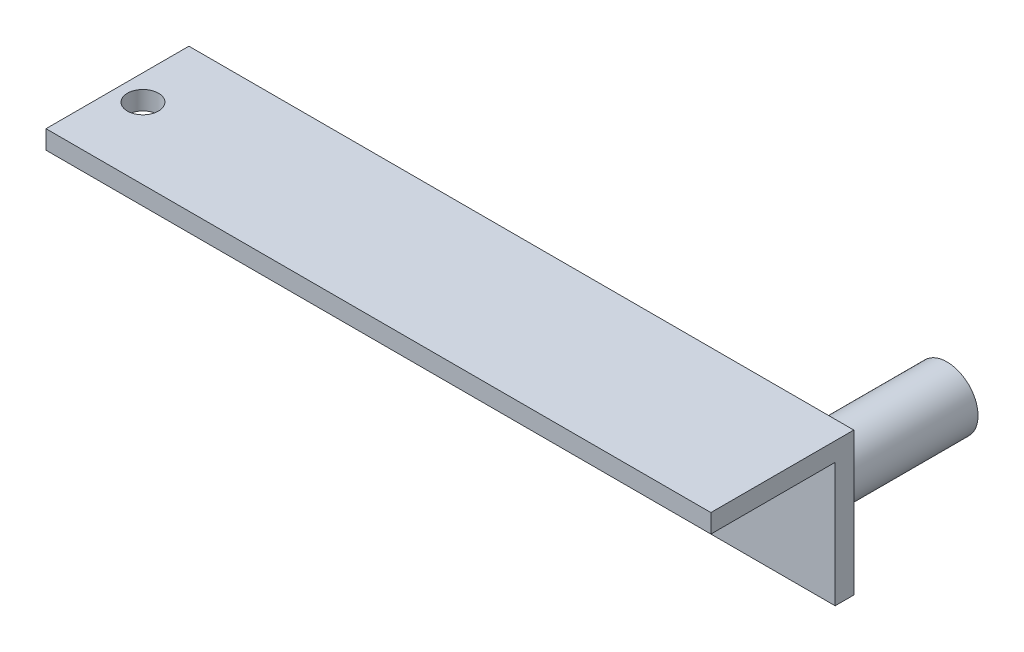
ISO-10303-21;
HEADER;
FILE_DESCRIPTION(('STEP AP214'),'2;1');
FILE_NAME('part.step','',(''),(''),'','','');
FILE_SCHEMA(('AUTOMOTIVE_DESIGN { 1 0 10303 214 1 1 1 1 }'));
ENDSEC;
DATA;
#1=APPLICATION_CONTEXT('core data for automotive mechanical design processes');
#2=APPLICATION_PROTOCOL_DEFINITION('international standard','automotive_design',2000,#1);
#3=PRODUCT_CONTEXT('',#1,'mechanical');
#4=PRODUCT('Part','Part','',(#3));
#5=PRODUCT_RELATED_PRODUCT_CATEGORY('part','',(#4));
#6=PRODUCT_DEFINITION_FORMATION('','',#4);
#7=PRODUCT_DEFINITION_CONTEXT('part definition',#1,'design');
#8=PRODUCT_DEFINITION('design','',#6,#7);
#9=PRODUCT_DEFINITION_SHAPE('','',#8);
#10=(LENGTH_UNIT() NAMED_UNIT(*) SI_UNIT(.MILLI.,.METRE.));
#11=(NAMED_UNIT(*) PLANE_ANGLE_UNIT() SI_UNIT($,.RADIAN.));
#12=(NAMED_UNIT(*) SI_UNIT($,.STERADIAN.) SOLID_ANGLE_UNIT());
#13=UNCERTAINTY_MEASURE_WITH_UNIT(LENGTH_MEASURE(1.E-05),#10,'distance_accuracy_value','');
#14=(GEOMETRIC_REPRESENTATION_CONTEXT(3) GLOBAL_UNCERTAINTY_ASSIGNED_CONTEXT((#13)) GLOBAL_UNIT_ASSIGNED_CONTEXT((#10,
#11,#12)) REPRESENTATION_CONTEXT('',''));
#15=CARTESIAN_POINT('',(0.,0.,0.));
#16=DIRECTION('',(0.,0.,1.));
#17=DIRECTION('',(1.,0.,0.));
#18=AXIS2_PLACEMENT_3D('',#15,#16,#17);
#19=CARTESIAN_POINT('',(0.,0.,3.));
#20=DIRECTION('',(1.,0.,0.));
#21=DIRECTION('',(0.,1.,0.));
#22=AXIS2_PLACEMENT_3D('',#19,#20,#21);
#23=PLANE('',#22);
#24=DIRECTION('',(0.,0.,1.));
#25=VECTOR('',#24,1.);
#26=CARTESIAN_POINT('',(0.,-3.,0.));
#27=LINE('',#26,#25);
#28=CARTESIAN_POINT('',(0.,-3.,0.));
#29=VERTEX_POINT('',#28);
#30=CARTESIAN_POINT('',(0.,-3.,3.));
#31=VERTEX_POINT('',#30);
#32=EDGE_CURVE('E55',#29,#31,#27,.T.);
#33=ORIENTED_EDGE('',*,*,#32,.F.);
#34=DIRECTION('',(0.,-1.,0.));
#35=VECTOR('',#34,1.);
#36=CARTESIAN_POINT('',(0.,0.,0.));
#37=LINE('',#36,#35);
#38=CARTESIAN_POINT('',(0.,-23.,0.));
#39=VERTEX_POINT('',#38);
#40=EDGE_CURVE('E79',#29,#39,#37,.T.);
#41=ORIENTED_EDGE('',*,*,#40,.T.);
#42=DIRECTION('',(0.,0.,-1.));
#43=VECTOR('',#42,1.);
#44=CARTESIAN_POINT('',(0.,-23.,3.));
#45=LINE('',#44,#43);
#46=CARTESIAN_POINT('',(0.,-23.,3.));
#47=VERTEX_POINT('',#46);
#48=EDGE_CURVE('E47',#47,#39,#45,.T.);
#49=ORIENTED_EDGE('',*,*,#48,.F.);
#50=DIRECTION('',(0.,-1.,0.));
#51=VECTOR('',#50,1.);
#52=CARTESIAN_POINT('',(0.,0.,3.));
#53=LINE('',#52,#51);
#54=EDGE_CURVE('E63',#31,#47,#53,.T.);
#55=ORIENTED_EDGE('',*,*,#54,.F.);
#56=EDGE_LOOP('',(#33,#41,#49,#55));
#57=FACE_BOUND('',#56,.T.);
#58=ADVANCED_FACE('F38',(#57),#23,.F.);
#59=CARTESIAN_POINT('',(0.,0.,3.));
#60=DIRECTION('',(0.,0.,-1.));
#61=DIRECTION('',(-1.,0.,0.));
#62=AXIS2_PLACEMENT_3D('',#59,#60,#61);
#63=PLANE('',#62);
#64=DIRECTION('',(1.,0.,0.));
#65=VECTOR('',#64,1.);
#66=CARTESIAN_POINT('',(0.,-3.,3.));
#67=LINE('',#66,#65);
#68=CARTESIAN_POINT('',(20.,-3.,3.));
#69=VERTEX_POINT('',#68);
#70=EDGE_CURVE('E125',#31,#69,#67,.T.);
#71=ORIENTED_EDGE('',*,*,#70,.F.);
#72=ORIENTED_EDGE('',*,*,#54,.T.);
#73=DIRECTION('',(1.,0.,0.));
#74=VECTOR('',#73,1.);
#75=CARTESIAN_POINT('',(0.,-23.,3.));
#76=LINE('',#75,#74);
#77=CARTESIAN_POINT('',(20.,-23.,3.));
#78=VERTEX_POINT('',#77);
#79=EDGE_CURVE('E94',#47,#78,#76,.T.);
#80=ORIENTED_EDGE('',*,*,#79,.T.);
#81=DIRECTION('',(0.,-1.,0.));
#82=VECTOR('',#81,1.);
#83=CARTESIAN_POINT('',(20.,0.,3.));
#84=LINE('',#83,#82);
#85=EDGE_CURVE('E86',#69,#78,#84,.T.);
#86=ORIENTED_EDGE('',*,*,#85,.F.);
#87=EDGE_LOOP('',(#71,#72,#80,#86));
#88=FACE_BOUND('',#87,.T.);
#89=ADVANCED_FACE('F128',(#88),#63,.F.);
#90=CARTESIAN_POINT('',(0.,0.,3.));
#91=DIRECTION('',(0.,1.,0.));
#92=DIRECTION('',(0.,0.,1.));
#93=AXIS2_PLACEMENT_3D('',#90,#91,#92);
#94=PLANE('',#93);
#95=CARTESIAN_POINT('',(-82.9,0.,11.5));
#96=DIRECTION('',(0.,1.,0.));
#97=DIRECTION('',(0.,0.,1.));
#98=AXIS2_PLACEMENT_3D('',#95,#96,#97);
#99=CIRCLE('',#98,2.49999999999999);
#100=CARTESIAN_POINT('',(-82.9,0.,14.));
#101=VERTEX_POINT('',#100);
#102=EDGE_CURVE('E312',#101,#101,#99,.T.);
#103=ORIENTED_EDGE('',*,*,#102,.F.);
#104=EDGE_LOOP('',(#103));
#105=FACE_BOUND('',#104,.T.);
#106=DIRECTION('',(1.,0.,0.));
#107=VECTOR('',#106,1.);
#108=CARTESIAN_POINT('',(0.,0.,0.));
#109=LINE('',#108,#107);
#110=CARTESIAN_POINT('',(-87.,0.,0.));
#111=VERTEX_POINT('',#110);
#112=CARTESIAN_POINT('',(20.,0.,0.));
#113=VERTEX_POINT('',#112);
#114=EDGE_CURVE('E102',#111,#113,#109,.T.);
#115=ORIENTED_EDGE('',*,*,#114,.F.);
#116=DIRECTION('',(0.,0.,-1.));
#117=VECTOR('',#116,1.);
#118=CARTESIAN_POINT('',(-87.,0.,0.));
#119=LINE('',#118,#117);
#120=CARTESIAN_POINT('',(-87.,0.,23.));
#121=VERTEX_POINT('',#120);
#122=EDGE_CURVE('E325',#121,#111,#119,.T.);
#123=ORIENTED_EDGE('',*,*,#122,.F.);
#124=DIRECTION('',(-1.,0.,0.));
#125=VECTOR('',#124,1.);
#126=CARTESIAN_POINT('',(0.,0.,23.));
#127=LINE('',#126,#125);
#128=CARTESIAN_POINT('',(20.,0.,23.));
#129=VERTEX_POINT('',#128);
#130=EDGE_CURVE('E116',#129,#121,#127,.T.);
#131=ORIENTED_EDGE('',*,*,#130,.F.);
#132=DIRECTION('',(0.,0.,-1.));
#133=VECTOR('',#132,1.);
#134=CARTESIAN_POINT('',(20.,0.,3.));
#135=LINE('',#134,#133);
#136=EDGE_CURVE('E42',#129,#113,#135,.T.);
#137=ORIENTED_EDGE('',*,*,#136,.T.);
#138=EDGE_LOOP('',(#115,#123,#131,#137));
#139=FACE_BOUND('',#138,.T.);
#140=ADVANCED_FACE('F40',(#105,#139),#94,.T.);
#141=CARTESIAN_POINT('',(0.,-23.,3.));
#142=DIRECTION('',(0.,1.,0.));
#143=DIRECTION('',(0.,0.,1.));
#144=AXIS2_PLACEMENT_3D('',#141,#142,#143);
#145=PLANE('',#144);
#146=DIRECTION('',(1.,0.,0.));
#147=VECTOR('',#146,1.);
#148=CARTESIAN_POINT('',(0.,-23.,0.));
#149=LINE('',#148,#147);
#150=CARTESIAN_POINT('',(20.,-23.,0.));
#151=VERTEX_POINT('',#150);
#152=EDGE_CURVE('E87',#39,#151,#149,.T.);
#153=ORIENTED_EDGE('',*,*,#152,.T.);
#154=DIRECTION('',(0.,0.,-1.));
#155=VECTOR('',#154,1.);
#156=CARTESIAN_POINT('',(20.,-23.,3.));
#157=LINE('',#156,#155);
#158=EDGE_CURVE('E95',#78,#151,#157,.T.);
#159=ORIENTED_EDGE('',*,*,#158,.F.);
#160=ORIENTED_EDGE('',*,*,#79,.F.);
#161=ORIENTED_EDGE('',*,*,#48,.T.);
#162=EDGE_LOOP('',(#153,#159,#160,#161));
#163=FACE_BOUND('',#162,.T.);
#164=ADVANCED_FACE('F91',(#163),#145,.F.);
#165=CARTESIAN_POINT('',(20.,0.,3.));
#166=DIRECTION('',(1.,0.,0.));
#167=DIRECTION('',(0.,1.,0.));
#168=AXIS2_PLACEMENT_3D('',#165,#166,#167);
#169=PLANE('',#168);
#170=DIRECTION('',(0.,-1.,0.));
#171=VECTOR('',#170,1.);
#172=CARTESIAN_POINT('',(20.,0.,0.));
#173=LINE('',#172,#171);
#174=EDGE_CURVE('E100',#113,#151,#173,.T.);
#175=ORIENTED_EDGE('',*,*,#174,.F.);
#176=ORIENTED_EDGE('',*,*,#136,.F.);
#177=DIRECTION('',(0.,1.,0.));
#178=VECTOR('',#177,1.);
#179=CARTESIAN_POINT('',(20.,0.,23.));
#180=LINE('',#179,#178);
#181=CARTESIAN_POINT('',(20.,-3.,23.));
#182=VERTEX_POINT('',#181);
#183=EDGE_CURVE('E122',#182,#129,#180,.T.);
#184=ORIENTED_EDGE('',*,*,#183,.F.);
#185=DIRECTION('',(0.,0.,-1.));
#186=VECTOR('',#185,1.);
#187=CARTESIAN_POINT('',(20.,-3.,23.));
#188=LINE('',#187,#186);
#189=EDGE_CURVE('E113',#182,#69,#188,.T.);
#190=ORIENTED_EDGE('',*,*,#189,.T.);
#191=ORIENTED_EDGE('',*,*,#85,.T.);
#192=ORIENTED_EDGE('',*,*,#158,.T.);
#193=EDGE_LOOP('',(#175,#176,#184,#190,#191,#192));
#194=FACE_BOUND('',#193,.T.);
#195=ADVANCED_FACE('F127',(#194),#169,.T.);
#196=CARTESIAN_POINT('',(0.,0.,0.));
#197=DIRECTION('',(0.,0.,-1.));
#198=DIRECTION('',(-1.,0.,0.));
#199=AXIS2_PLACEMENT_3D('',#196,#197,#198);
#200=PLANE('',#199);
#201=CARTESIAN_POINT('',(10.,-13.,0.));
#202=DIRECTION('',(0.,0.,-1.));
#203=DIRECTION('',(-1.,0.,0.));
#204=AXIS2_PLACEMENT_3D('',#201,#202,#203);
#205=CIRCLE('',#204,5.);
#206=CARTESIAN_POINT('',(5.,-13.,0.));
#207=VERTEX_POINT('',#206);
#208=EDGE_CURVE('E11',#207,#207,#205,.T.);
#209=ORIENTED_EDGE('',*,*,#208,.F.);
#210=EDGE_LOOP('',(#209));
#211=FACE_BOUND('',#210,.T.);
#212=ORIENTED_EDGE('',*,*,#114,.T.);
#213=ORIENTED_EDGE('',*,*,#174,.T.);
#214=ORIENTED_EDGE('',*,*,#152,.F.);
#215=ORIENTED_EDGE('',*,*,#40,.F.);
#216=DIRECTION('',(1.,0.,0.));
#217=VECTOR('',#216,1.);
#218=CARTESIAN_POINT('',(-87.,-3.00000000000001,0.));
#219=LINE('',#218,#217);
#220=CARTESIAN_POINT('',(-87.,-3.00000000000001,0.));
#221=VERTEX_POINT('',#220);
#222=EDGE_CURVE('E328',#221,#29,#219,.T.);
#223=ORIENTED_EDGE('',*,*,#222,.F.);
#224=DIRECTION('',(0.,-1.,0.));
#225=VECTOR('',#224,1.);
#226=CARTESIAN_POINT('',(-87.,0.,0.));
#227=LINE('',#226,#225);
#228=EDGE_CURVE('E316',#111,#221,#227,.T.);
#229=ORIENTED_EDGE('',*,*,#228,.F.);
#230=EDGE_LOOP('',(#212,#213,#214,#215,#223,#229));
#231=FACE_BOUND('',#230,.T.);
#232=ADVANCED_FACE('F98',(#211,#231),#200,.T.);
#233=CARTESIAN_POINT('',(0.,-3.,23.));
#234=DIRECTION('',(0.,1.,0.));
#235=DIRECTION('',(0.,0.,1.));
#236=AXIS2_PLACEMENT_3D('',#233,#234,#235);
#237=PLANE('',#236);
#238=CARTESIAN_POINT('',(-82.9,-3.,11.5));
#239=DIRECTION('',(0.,1.,0.));
#240=DIRECTION('',(0.,0.,1.));
#241=AXIS2_PLACEMENT_3D('',#238,#239,#240);
#242=CIRCLE('',#241,2.49999999999999);
#243=CARTESIAN_POINT('',(-82.9,-3.,14.));
#244=VERTEX_POINT('',#243);
#245=EDGE_CURVE('E309',#244,#244,#242,.T.);
#246=ORIENTED_EDGE('',*,*,#245,.T.);
#247=EDGE_LOOP('',(#246));
#248=FACE_BOUND('',#247,.T.);
#249=ORIENTED_EDGE('',*,*,#70,.T.);
#250=ORIENTED_EDGE('',*,*,#189,.F.);
#251=DIRECTION('',(1.,0.,0.));
#252=VECTOR('',#251,1.);
#253=CARTESIAN_POINT('',(0.,-3.,23.));
#254=LINE('',#253,#252);
#255=CARTESIAN_POINT('',(-87.,-3.00000000000001,23.));
#256=VERTEX_POINT('',#255);
#257=EDGE_CURVE('E340',#256,#182,#254,.T.);
#258=ORIENTED_EDGE('',*,*,#257,.F.);
#259=DIRECTION('',(0.,0.,1.));
#260=VECTOR('',#259,1.);
#261=CARTESIAN_POINT('',(-87.,-3.00000000000001,0.));
#262=LINE('',#261,#260);
#263=EDGE_CURVE('E319',#221,#256,#262,.T.);
#264=ORIENTED_EDGE('',*,*,#263,.F.);
#265=ORIENTED_EDGE('',*,*,#222,.T.);
#266=ORIENTED_EDGE('',*,*,#32,.T.);
#267=EDGE_LOOP('',(#249,#250,#258,#264,#265,#266));
#268=FACE_BOUND('',#267,.T.);
#269=ADVANCED_FACE('F139',(#248,#268),#237,.F.);
#270=CARTESIAN_POINT('',(0.,0.,23.));
#271=DIRECTION('',(0.,0.,1.));
#272=DIRECTION('',(1.,0.,0.));
#273=AXIS2_PLACEMENT_3D('',#270,#271,#272);
#274=PLANE('',#273);
#275=ORIENTED_EDGE('',*,*,#130,.T.);
#276=DIRECTION('',(0.,1.,0.));
#277=VECTOR('',#276,1.);
#278=CARTESIAN_POINT('',(-87.,0.,23.));
#279=LINE('',#278,#277);
#280=EDGE_CURVE('E322',#256,#121,#279,.T.);
#281=ORIENTED_EDGE('',*,*,#280,.F.);
#282=ORIENTED_EDGE('',*,*,#257,.T.);
#283=ORIENTED_EDGE('',*,*,#183,.T.);
#284=EDGE_LOOP('',(#275,#281,#282,#283));
#285=FACE_BOUND('',#284,.T.);
#286=ADVANCED_FACE('F162',(#285),#274,.T.);
#287=CARTESIAN_POINT('',(10.,-13.,-25.));
#288=DIRECTION('',(0.,0.,1.));
#289=DIRECTION('',(1.,0.,0.));
#290=AXIS2_PLACEMENT_3D('',#287,#288,#289);
#291=CYLINDRICAL_SURFACE('',#290,5.);
#292=CARTESIAN_POINT('',(10.,-13.,-25.));
#293=DIRECTION('',(0.,0.,-1.));
#294=DIRECTION('',(-1.,0.,0.));
#295=AXIS2_PLACEMENT_3D('',#292,#293,#294);
#296=CIRCLE('',#295,5.);
#297=CARTESIAN_POINT('',(5.,-13.,-25.));
#298=VERTEX_POINT('',#297);
#299=EDGE_CURVE('E335',#298,#298,#296,.T.);
#300=ORIENTED_EDGE('',*,*,#299,.F.);
#301=EDGE_LOOP('',(#300));
#302=FACE_BOUND('',#301,.T.);
#303=ORIENTED_EDGE('',*,*,#208,.T.);
#304=EDGE_LOOP('',(#303));
#305=FACE_BOUND('',#304,.T.);
#306=ADVANCED_FACE('F170',(#302,#305),#291,.T.);
#307=CARTESIAN_POINT('',(10.,-13.,-25.));
#308=DIRECTION('',(0.,0.,-1.));
#309=DIRECTION('',(-1.,0.,0.));
#310=AXIS2_PLACEMENT_3D('',#307,#308,#309);
#311=PLANE('',#310);
#312=CARTESIAN_POINT('',(10.,-13.,-25.));
#313=DIRECTION('',(0.,0.,-1.));
#314=DIRECTION('',(-1.,0.,0.));
#315=AXIS2_PLACEMENT_3D('',#312,#313,#314);
#316=CIRCLE('',#315,3.);
#317=CARTESIAN_POINT('',(7.,-13.,-25.));
#318=VERTEX_POINT('',#317);
#319=EDGE_CURVE('E331',#318,#318,#316,.T.);
#320=ORIENTED_EDGE('',*,*,#319,.F.);
#321=EDGE_LOOP('',(#320));
#322=FACE_BOUND('',#321,.T.);
#323=ORIENTED_EDGE('',*,*,#299,.T.);
#324=EDGE_LOOP('',(#323));
#325=FACE_BOUND('',#324,.T.);
#326=ADVANCED_FACE('F177',(#322,#325),#311,.T.);
#327=CARTESIAN_POINT('',(10.,-13.,0.));
#328=DIRECTION('',(0.,0.,-1.));
#329=DIRECTION('',(-1.,0.,0.));
#330=AXIS2_PLACEMENT_3D('',#327,#328,#329);
#331=CYLINDRICAL_SURFACE('',#330,3.);
#332=CARTESIAN_POINT('',(10.,-13.,0.));
#333=DIRECTION('',(0.,0.,-1.));
#334=DIRECTION('',(-1.,0.,0.));
#335=AXIS2_PLACEMENT_3D('',#332,#333,#334);
#336=CIRCLE('',#335,3.);
#337=CARTESIAN_POINT('',(7.,-13.,0.));
#338=VERTEX_POINT('',#337);
#339=EDGE_CURVE('E332',#338,#338,#336,.T.);
#340=ORIENTED_EDGE('',*,*,#339,.F.);
#341=EDGE_LOOP('',(#340));
#342=FACE_BOUND('',#341,.T.);
#343=ORIENTED_EDGE('',*,*,#319,.T.);
#344=EDGE_LOOP('',(#343));
#345=FACE_BOUND('',#344,.T.);
#346=ADVANCED_FACE('F185',(#342,#345),#331,.F.);
#347=CARTESIAN_POINT('',(10.,-13.,0.));
#348=DIRECTION('',(0.,0.,-1.));
#349=DIRECTION('',(-1.,0.,0.));
#350=AXIS2_PLACEMENT_3D('',#347,#348,#349);
#351=PLANE('',#350);
#352=ORIENTED_EDGE('',*,*,#339,.T.);
#353=EDGE_LOOP('',(#352));
#354=FACE_BOUND('',#353,.T.);
#355=ADVANCED_FACE('F193',(#354),#351,.T.);
#356=CARTESIAN_POINT('',(-87.,0.,0.));
#357=DIRECTION('',(-1.,0.,0.));
#358=DIRECTION('',(0.,-1.,0.));
#359=AXIS2_PLACEMENT_3D('',#356,#357,#358);
#360=PLANE('',#359);
#361=ORIENTED_EDGE('',*,*,#228,.T.);
#362=ORIENTED_EDGE('',*,*,#263,.T.);
#363=ORIENTED_EDGE('',*,*,#280,.T.);
#364=ORIENTED_EDGE('',*,*,#122,.T.);
#365=EDGE_LOOP('',(#361,#362,#363,#364));
#366=FACE_BOUND('',#365,.T.);
#367=ADVANCED_FACE('F201',(#366),#360,.T.);
#368=CARTESIAN_POINT('',(-82.9,-3.,11.5));
#369=DIRECTION('',(0.,1.,0.));
#370=DIRECTION('',(0.,0.,1.));
#371=AXIS2_PLACEMENT_3D('',#368,#369,#370);
#372=CYLINDRICAL_SURFACE('',#371,2.49999999999999);
#373=ORIENTED_EDGE('',*,*,#245,.F.);
#374=EDGE_LOOP('',(#373));
#375=FACE_BOUND('',#374,.T.);
#376=ORIENTED_EDGE('',*,*,#102,.T.);
#377=EDGE_LOOP('',(#376));
#378=FACE_BOUND('',#377,.T.);
#379=ADVANCED_FACE('F209',(#375,#378),#372,.F.);
#380=CLOSED_SHELL('',(#58,#89,#140,#164,#195,#232,#269,#286,#306,#326,#346,#355,#367,#379));
#381=MANIFOLD_SOLID_BREP('B2',#380);
#382=ADVANCED_BREP_SHAPE_REPRESENTATION('',(#18,#381),#14);
#383=SHAPE_DEFINITION_REPRESENTATION(#9,#382);
ENDSEC;
END-ISO-10303-21;
